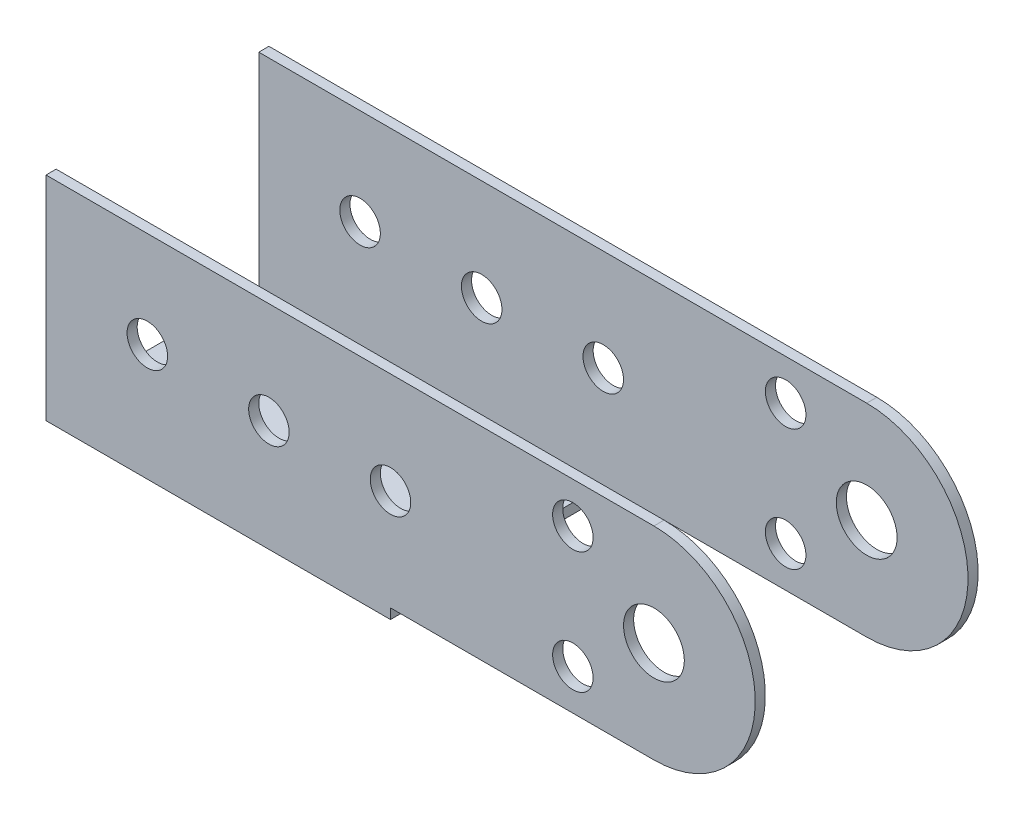
ISO-10303-21;
HEADER;
FILE_DESCRIPTION(('STEP AP214'),'2;1');
FILE_NAME('part.step','',(''),(''),'','','');
FILE_SCHEMA(('AUTOMOTIVE_DESIGN { 1 0 10303 214 1 1 1 1 }'));
ENDSEC;
DATA;
#1=APPLICATION_CONTEXT('core data for automotive mechanical design processes');
#2=APPLICATION_PROTOCOL_DEFINITION('international standard','automotive_design',2000,#1);
#3=PRODUCT_CONTEXT('',#1,'mechanical');
#4=PRODUCT('Part','Part','',(#3));
#5=PRODUCT_RELATED_PRODUCT_CATEGORY('part','',(#4));
#6=PRODUCT_DEFINITION_FORMATION('','',#4);
#7=PRODUCT_DEFINITION_CONTEXT('part definition',#1,'design');
#8=PRODUCT_DEFINITION('design','',#6,#7);
#9=PRODUCT_DEFINITION_SHAPE('','',#8);
#10=(LENGTH_UNIT() NAMED_UNIT(*) SI_UNIT(.MILLI.,.METRE.));
#11=(NAMED_UNIT(*) PLANE_ANGLE_UNIT() SI_UNIT($,.RADIAN.));
#12=(NAMED_UNIT(*) SI_UNIT($,.STERADIAN.) SOLID_ANGLE_UNIT());
#13=UNCERTAINTY_MEASURE_WITH_UNIT(LENGTH_MEASURE(1.E-05),#10,'distance_accuracy_value','');
#14=(GEOMETRIC_REPRESENTATION_CONTEXT(3) GLOBAL_UNCERTAINTY_ASSIGNED_CONTEXT((#13)) GLOBAL_UNIT_ASSIGNED_CONTEXT((#10,
#11,#12)) REPRESENTATION_CONTEXT('',''));
#15=CARTESIAN_POINT('',(0.,0.,0.));
#16=DIRECTION('',(0.,0.,1.));
#17=DIRECTION('',(1.,0.,0.));
#18=AXIS2_PLACEMENT_3D('',#15,#16,#17);
#19=CARTESIAN_POINT('',(15.,0.,10.5));
#20=DIRECTION('',(0.,0.,1.));
#21=DIRECTION('',(1.,0.,0.));
#22=AXIS2_PLACEMENT_3D('',#19,#20,#21);
#23=PLANE('',#22);
#24=CARTESIAN_POINT('',(-3.99999999999999,0.,10.5));
#25=DIRECTION('',(0.,0.,1.));
#26=DIRECTION('',(1.,0.,0.));
#27=AXIS2_PLACEMENT_3D('',#24,#25,#26);
#28=CIRCLE('',#27,1.);
#29=CARTESIAN_POINT('',(-2.99999999999999,0.,10.5));
#30=VERTEX_POINT('',#29);
#31=EDGE_CURVE('E193',#30,#30,#28,.T.);
#32=ORIENTED_EDGE('',*,*,#31,.F.);
#33=EDGE_LOOP('',(#32));
#34=FACE_BOUND('',#33,.T.);
#35=CARTESIAN_POINT('',(11.,3.,10.5));
#36=DIRECTION('',(0.,0.,1.));
#37=DIRECTION('',(1.,0.,0.));
#38=AXIS2_PLACEMENT_3D('',#35,#36,#37);
#39=CIRCLE('',#38,1.);
#40=CARTESIAN_POINT('',(12.,3.,10.5));
#41=VERTEX_POINT('',#40);
#42=EDGE_CURVE('E205',#41,#41,#39,.T.);
#43=ORIENTED_EDGE('',*,*,#42,.F.);
#44=EDGE_LOOP('',(#43));
#45=FACE_BOUND('',#44,.T.);
#46=CARTESIAN_POINT('',(15.,0.,10.5));
#47=DIRECTION('',(0.,0.,1.));
#48=DIRECTION('',(1.,0.,0.));
#49=AXIS2_PLACEMENT_3D('',#46,#47,#48);
#50=CIRCLE('',#49,1.5);
#51=CARTESIAN_POINT('',(16.5,0.,10.5));
#52=VERTEX_POINT('',#51);
#53=EDGE_CURVE('E217',#52,#52,#50,.T.);
#54=ORIENTED_EDGE('',*,*,#53,.F.);
#55=EDGE_LOOP('',(#54));
#56=FACE_BOUND('',#55,.T.);
#57=DIRECTION('',(0.,-1.,0.));
#58=VECTOR('',#57,1.);
#59=CARTESIAN_POINT('',(-15.,5.,10.5));
#60=LINE('',#59,#58);
#61=CARTESIAN_POINT('',(-15.,5.,10.5));
#62=VERTEX_POINT('',#61);
#63=CARTESIAN_POINT('',(-15.,-5.5,10.5));
#64=VERTEX_POINT('',#63);
#65=EDGE_CURVE('E223',#62,#64,#60,.T.);
#66=ORIENTED_EDGE('',*,*,#65,.T.);
#67=DIRECTION('',(1.,0.,0.));
#68=VECTOR('',#67,1.);
#69=CARTESIAN_POINT('',(2.00000000000001,-5.5,10.5));
#70=LINE('',#69,#68);
#71=CARTESIAN_POINT('',(2.00000000000001,-5.5,10.5));
#72=VERTEX_POINT('',#71);
#73=EDGE_CURVE('E167',#64,#72,#70,.T.);
#74=ORIENTED_EDGE('',*,*,#73,.T.);
#75=DIRECTION('',(0.,1.,0.));
#76=VECTOR('',#75,1.);
#77=CARTESIAN_POINT('',(2.00000000000001,-5.5,10.5));
#78=LINE('',#77,#76);
#79=CARTESIAN_POINT('',(2.00000000000001,-5.,10.5));
#80=VERTEX_POINT('',#79);
#81=EDGE_CURVE('E176',#72,#80,#78,.T.);
#82=ORIENTED_EDGE('',*,*,#81,.T.);
#83=DIRECTION('',(1.,0.,0.));
#84=VECTOR('',#83,1.);
#85=CARTESIAN_POINT('',(-15.,-5.,10.5));
#86=LINE('',#85,#84);
#87=CARTESIAN_POINT('',(15.,-5.,10.5));
#88=VERTEX_POINT('',#87);
#89=EDGE_CURVE('E225',#80,#88,#86,.T.);
#90=ORIENTED_EDGE('',*,*,#89,.T.);
#91=CARTESIAN_POINT('',(15.,0.,10.5));
#92=DIRECTION('',(0.,0.,1.));
#93=DIRECTION('',(1.,0.,0.));
#94=AXIS2_PLACEMENT_3D('',#91,#92,#93);
#95=CIRCLE('',#94,5.);
#96=CARTESIAN_POINT('',(15.,5.,10.5));
#97=VERTEX_POINT('',#96);
#98=EDGE_CURVE('E228',#88,#97,#95,.T.);
#99=ORIENTED_EDGE('',*,*,#98,.T.);
#100=DIRECTION('',(-1.,0.,0.));
#101=VECTOR('',#100,1.);
#102=CARTESIAN_POINT('',(15.,5.,10.5));
#103=LINE('',#102,#101);
#104=EDGE_CURVE('E230',#97,#62,#103,.T.);
#105=ORIENTED_EDGE('',*,*,#104,.T.);
#106=EDGE_LOOP('',(#66,#74,#82,#90,#99,#105));
#107=FACE_BOUND('',#106,.T.);
#108=CARTESIAN_POINT('',(11.,-3.,10.5));
#109=DIRECTION('',(0.,0.,1.));
#110=DIRECTION('',(1.,0.,0.));
#111=AXIS2_PLACEMENT_3D('',#108,#109,#110);
#112=CIRCLE('',#111,1.);
#113=CARTESIAN_POINT('',(12.,-3.,10.5));
#114=VERTEX_POINT('',#113);
#115=EDGE_CURVE('E211',#114,#114,#112,.T.);
#116=ORIENTED_EDGE('',*,*,#115,.F.);
#117=EDGE_LOOP('',(#116));
#118=FACE_BOUND('',#117,.T.);
#119=CARTESIAN_POINT('',(2.00000000000001,0.,10.5));
#120=DIRECTION('',(0.,0.,1.));
#121=DIRECTION('',(1.,0.,0.));
#122=AXIS2_PLACEMENT_3D('',#119,#120,#121);
#123=CIRCLE('',#122,1.);
#124=CARTESIAN_POINT('',(3.00000000000001,0.,10.5));
#125=VERTEX_POINT('',#124);
#126=EDGE_CURVE('E199',#125,#125,#123,.T.);
#127=ORIENTED_EDGE('',*,*,#126,.F.);
#128=EDGE_LOOP('',(#127));
#129=FACE_BOUND('',#128,.T.);
#130=CARTESIAN_POINT('',(-10.,0.253438211378566,10.5));
#131=DIRECTION('',(0.,0.,1.));
#132=DIRECTION('',(1.,0.,0.));
#133=AXIS2_PLACEMENT_3D('',#130,#131,#132);
#134=CIRCLE('',#133,1.);
#135=CARTESIAN_POINT('',(-9.,0.253438211378566,10.5));
#136=VERTEX_POINT('',#135);
#137=EDGE_CURVE('E187',#136,#136,#134,.T.);
#138=ORIENTED_EDGE('',*,*,#137,.F.);
#139=EDGE_LOOP('',(#138));
#140=FACE_BOUND('',#139,.T.);
#141=ADVANCED_FACE('F35',(#34,#45,#56,#107,#118,#129,#140),#23,.T.);
#142=CARTESIAN_POINT('',(15.,0.,10.));
#143=DIRECTION('',(0.,0.,1.));
#144=DIRECTION('',(1.,0.,0.));
#145=AXIS2_PLACEMENT_3D('',#142,#143,#144);
#146=PLANE('',#145);
#147=DIRECTION('',(0.,-1.,0.));
#148=VECTOR('',#147,1.);
#149=CARTESIAN_POINT('',(-15.,5.,10.));
#150=LINE('',#149,#148);
#151=CARTESIAN_POINT('',(-15.,5.,10.));
#152=VERTEX_POINT('',#151);
#153=CARTESIAN_POINT('',(-15.,-5.,10.));
#154=VERTEX_POINT('',#153);
#155=EDGE_CURVE('E220',#152,#154,#150,.T.);
#156=ORIENTED_EDGE('',*,*,#155,.F.);
#157=DIRECTION('',(-1.,0.,0.));
#158=VECTOR('',#157,1.);
#159=CARTESIAN_POINT('',(15.,5.,10.));
#160=LINE('',#159,#158);
#161=CARTESIAN_POINT('',(15.,5.,10.));
#162=VERTEX_POINT('',#161);
#163=EDGE_CURVE('E226',#162,#152,#160,.T.);
#164=ORIENTED_EDGE('',*,*,#163,.F.);
#165=CARTESIAN_POINT('',(15.,0.,10.));
#166=DIRECTION('',(0.,0.,1.));
#167=DIRECTION('',(1.,0.,0.));
#168=AXIS2_PLACEMENT_3D('',#165,#166,#167);
#169=CIRCLE('',#168,5.);
#170=CARTESIAN_POINT('',(15.,-5.,10.));
#171=VERTEX_POINT('',#170);
#172=EDGE_CURVE('E238',#171,#162,#169,.T.);
#173=ORIENTED_EDGE('',*,*,#172,.F.);
#174=DIRECTION('',(1.,0.,0.));
#175=VECTOR('',#174,1.);
#176=CARTESIAN_POINT('',(-15.,-5.,10.));
#177=LINE('',#176,#175);
#178=CARTESIAN_POINT('',(2.00000000000001,-5.,10.));
#179=VERTEX_POINT('',#178);
#180=EDGE_CURVE('E235',#179,#171,#177,.T.);
#181=ORIENTED_EDGE('',*,*,#180,.F.);
#182=EDGE_CURVE('E236',#154,#179,#177,.T.);
#183=ORIENTED_EDGE('',*,*,#182,.F.);
#184=EDGE_LOOP('',(#156,#164,#173,#181,#183));
#185=FACE_BOUND('',#184,.T.);
#186=CARTESIAN_POINT('',(15.,0.,10.));
#187=DIRECTION('',(0.,0.,1.));
#188=DIRECTION('',(1.,0.,0.));
#189=AXIS2_PLACEMENT_3D('',#186,#187,#188);
#190=CIRCLE('',#189,1.5);
#191=CARTESIAN_POINT('',(16.5,0.,10.));
#192=VERTEX_POINT('',#191);
#193=EDGE_CURVE('E214',#192,#192,#190,.T.);
#194=ORIENTED_EDGE('',*,*,#193,.T.);
#195=EDGE_LOOP('',(#194));
#196=FACE_BOUND('',#195,.T.);
#197=CARTESIAN_POINT('',(11.,-3.,10.));
#198=DIRECTION('',(0.,0.,1.));
#199=DIRECTION('',(1.,0.,0.));
#200=AXIS2_PLACEMENT_3D('',#197,#198,#199);
#201=CIRCLE('',#200,1.);
#202=CARTESIAN_POINT('',(12.,-3.,10.));
#203=VERTEX_POINT('',#202);
#204=EDGE_CURVE('E208',#203,#203,#201,.T.);
#205=ORIENTED_EDGE('',*,*,#204,.T.);
#206=EDGE_LOOP('',(#205));
#207=FACE_BOUND('',#206,.T.);
#208=CARTESIAN_POINT('',(11.,3.,10.));
#209=DIRECTION('',(0.,0.,1.));
#210=DIRECTION('',(1.,0.,0.));
#211=AXIS2_PLACEMENT_3D('',#208,#209,#210);
#212=CIRCLE('',#211,1.);
#213=CARTESIAN_POINT('',(12.,3.,10.));
#214=VERTEX_POINT('',#213);
#215=EDGE_CURVE('E202',#214,#214,#212,.T.);
#216=ORIENTED_EDGE('',*,*,#215,.T.);
#217=EDGE_LOOP('',(#216));
#218=FACE_BOUND('',#217,.T.);
#219=CARTESIAN_POINT('',(2.00000000000001,0.,10.));
#220=DIRECTION('',(0.,0.,1.));
#221=DIRECTION('',(1.,0.,0.));
#222=AXIS2_PLACEMENT_3D('',#219,#220,#221);
#223=CIRCLE('',#222,1.);
#224=CARTESIAN_POINT('',(3.00000000000001,0.,10.));
#225=VERTEX_POINT('',#224);
#226=EDGE_CURVE('E196',#225,#225,#223,.T.);
#227=ORIENTED_EDGE('',*,*,#226,.T.);
#228=EDGE_LOOP('',(#227));
#229=FACE_BOUND('',#228,.T.);
#230=CARTESIAN_POINT('',(-3.99999999999999,0.,10.));
#231=DIRECTION('',(0.,0.,1.));
#232=DIRECTION('',(1.,0.,0.));
#233=AXIS2_PLACEMENT_3D('',#230,#231,#232);
#234=CIRCLE('',#233,1.);
#235=CARTESIAN_POINT('',(-2.99999999999999,0.,10.));
#236=VERTEX_POINT('',#235);
#237=EDGE_CURVE('E190',#236,#236,#234,.T.);
#238=ORIENTED_EDGE('',*,*,#237,.T.);
#239=EDGE_LOOP('',(#238));
#240=FACE_BOUND('',#239,.T.);
#241=CARTESIAN_POINT('',(-10.,0.253438211378566,10.));
#242=DIRECTION('',(0.,0.,1.));
#243=DIRECTION('',(1.,0.,0.));
#244=AXIS2_PLACEMENT_3D('',#241,#242,#243);
#245=CIRCLE('',#244,1.);
#246=CARTESIAN_POINT('',(-9.,0.253438211378566,10.));
#247=VERTEX_POINT('',#246);
#248=EDGE_CURVE('E182',#247,#247,#245,.T.);
#249=ORIENTED_EDGE('',*,*,#248,.T.);
#250=EDGE_LOOP('',(#249));
#251=FACE_BOUND('',#250,.T.);
#252=ADVANCED_FACE('F254',(#185,#196,#207,#218,#229,#240,#251),#146,.F.);
#253=CARTESIAN_POINT('',(-15.,5.,10.5));
#254=DIRECTION('',(1.,0.,0.));
#255=DIRECTION('',(0.,0.,-1.));
#256=AXIS2_PLACEMENT_3D('',#253,#254,#255);
#257=PLANE('',#256);
#258=ORIENTED_EDGE('',*,*,#155,.T.);
#259=DIRECTION('',(0.,0.,1.));
#260=VECTOR('',#259,1.);
#261=CARTESIAN_POINT('',(-15.,-5.,10.5));
#262=LINE('',#261,#260);
#263=CARTESIAN_POINT('',(-15.,-5.,0.));
#264=VERTEX_POINT('',#263);
#265=EDGE_CURVE('E162',#264,#154,#262,.T.);
#266=ORIENTED_EDGE('',*,*,#265,.F.);
#267=DIRECTION('',(0.,-1.,0.));
#268=VECTOR('',#267,1.);
#269=CARTESIAN_POINT('',(-15.,5.,0.));
#270=LINE('',#269,#268);
#271=CARTESIAN_POINT('',(-15.,5.,0.));
#272=VERTEX_POINT('',#271);
#273=EDGE_CURVE('E158',#272,#264,#270,.T.);
#274=ORIENTED_EDGE('',*,*,#273,.F.);
#275=DIRECTION('',(0.,0.,1.));
#276=VECTOR('',#275,1.);
#277=CARTESIAN_POINT('',(-15.,5.,-0.5));
#278=LINE('',#277,#276);
#279=CARTESIAN_POINT('',(-15.,5.,-0.5));
#280=VERTEX_POINT('',#279);
#281=EDGE_CURVE('E129',#280,#272,#278,.T.);
#282=ORIENTED_EDGE('',*,*,#281,.F.);
#283=DIRECTION('',(0.,1.,0.));
#284=VECTOR('',#283,1.);
#285=CARTESIAN_POINT('',(-15.,-5.5,-0.5));
#286=LINE('',#285,#284);
#287=CARTESIAN_POINT('',(-15.,-5.5,-0.5));
#288=VERTEX_POINT('',#287);
#289=EDGE_CURVE('E139',#288,#280,#286,.T.);
#290=ORIENTED_EDGE('',*,*,#289,.F.);
#291=DIRECTION('',(0.,0.,1.));
#292=VECTOR('',#291,1.);
#293=CARTESIAN_POINT('',(-15.,-5.5,10.5));
#294=LINE('',#293,#292);
#295=EDGE_CURVE('E164',#288,#64,#294,.T.);
#296=ORIENTED_EDGE('',*,*,#295,.T.);
#297=ORIENTED_EDGE('',*,*,#65,.F.);
#298=DIRECTION('',(0.,0.,-1.));
#299=VECTOR('',#298,1.);
#300=CARTESIAN_POINT('',(-15.,5.,10.5));
#301=LINE('',#300,#299);
#302=EDGE_CURVE('E232',#62,#152,#301,.T.);
#303=ORIENTED_EDGE('',*,*,#302,.T.);
#304=EDGE_LOOP('',(#258,#266,#274,#282,#290,#296,#297,#303));
#305=FACE_BOUND('',#304,.T.);
#306=ADVANCED_FACE('F37',(#305),#257,.F.);
#307=CARTESIAN_POINT('',(-15.,-5.,10.5));
#308=DIRECTION('',(0.,1.,0.));
#309=DIRECTION('',(0.,0.,1.));
#310=AXIS2_PLACEMENT_3D('',#307,#308,#309);
#311=PLANE('',#310);
#312=ORIENTED_EDGE('',*,*,#89,.F.);
#313=DIRECTION('',(0.,0.,-1.));
#314=VECTOR('',#313,1.);
#315=CARTESIAN_POINT('',(2.00000000000001,-5.,-0.5));
#316=LINE('',#315,#314);
#317=EDGE_CURVE('E168',#80,#179,#316,.T.);
#318=ORIENTED_EDGE('',*,*,#317,.T.);
#319=ORIENTED_EDGE('',*,*,#180,.T.);
#320=DIRECTION('',(0.,0.,-1.));
#321=VECTOR('',#320,1.);
#322=CARTESIAN_POINT('',(15.,-5.,10.5));
#323=LINE('',#322,#321);
#324=EDGE_CURVE('E11',#88,#171,#323,.T.);
#325=ORIENTED_EDGE('',*,*,#324,.F.);
#326=EDGE_LOOP('',(#312,#318,#319,#325));
#327=FACE_BOUND('',#326,.T.);
#328=ADVANCED_FACE('F273',(#327),#311,.F.);
#329=CARTESIAN_POINT('',(15.,0.,10.5));
#330=DIRECTION('',(0.,0.,-1.));
#331=DIRECTION('',(-1.,0.,0.));
#332=AXIS2_PLACEMENT_3D('',#329,#330,#331);
#333=CYLINDRICAL_SURFACE('',#332,5.);
#334=ORIENTED_EDGE('',*,*,#172,.T.);
#335=DIRECTION('',(0.,0.,-1.));
#336=VECTOR('',#335,1.);
#337=CARTESIAN_POINT('',(15.,5.,10.5));
#338=LINE('',#337,#336);
#339=EDGE_CURVE('E43',#97,#162,#338,.T.);
#340=ORIENTED_EDGE('',*,*,#339,.F.);
#341=ORIENTED_EDGE('',*,*,#98,.F.);
#342=ORIENTED_EDGE('',*,*,#324,.T.);
#343=EDGE_LOOP('',(#334,#340,#341,#342));
#344=FACE_BOUND('',#343,.T.);
#345=ADVANCED_FACE('F274',(#344),#333,.T.);
#346=CARTESIAN_POINT('',(15.,5.,10.5));
#347=DIRECTION('',(0.,-1.,0.));
#348=DIRECTION('',(0.,0.,-1.));
#349=AXIS2_PLACEMENT_3D('',#346,#347,#348);
#350=PLANE('',#349);
#351=ORIENTED_EDGE('',*,*,#163,.T.);
#352=ORIENTED_EDGE('',*,*,#302,.F.);
#353=ORIENTED_EDGE('',*,*,#104,.F.);
#354=ORIENTED_EDGE('',*,*,#339,.T.);
#355=EDGE_LOOP('',(#351,#352,#353,#354));
#356=FACE_BOUND('',#355,.T.);
#357=ADVANCED_FACE('F247',(#356),#350,.F.);
#358=CARTESIAN_POINT('',(15.,0.,10.5));
#359=DIRECTION('',(0.,0.,-1.));
#360=DIRECTION('',(-1.,0.,0.));
#361=AXIS2_PLACEMENT_3D('',#358,#359,#360);
#362=CYLINDRICAL_SURFACE('',#361,1.5);
#363=ORIENTED_EDGE('',*,*,#53,.T.);
#364=EDGE_LOOP('',(#363));
#365=FACE_BOUND('',#364,.T.);
#366=ORIENTED_EDGE('',*,*,#193,.F.);
#367=EDGE_LOOP('',(#366));
#368=FACE_BOUND('',#367,.T.);
#369=ADVANCED_FACE('F281',(#365,#368),#362,.F.);
#370=CARTESIAN_POINT('',(11.,-3.,10.5));
#371=DIRECTION('',(0.,0.,-1.));
#372=DIRECTION('',(-1.,0.,0.));
#373=AXIS2_PLACEMENT_3D('',#370,#371,#372);
#374=CYLINDRICAL_SURFACE('',#373,1.);
#375=ORIENTED_EDGE('',*,*,#115,.T.);
#376=EDGE_LOOP('',(#375));
#377=FACE_BOUND('',#376,.T.);
#378=ORIENTED_EDGE('',*,*,#204,.F.);
#379=EDGE_LOOP('',(#378));
#380=FACE_BOUND('',#379,.T.);
#381=ADVANCED_FACE('F295',(#377,#380),#374,.F.);
#382=CARTESIAN_POINT('',(11.,3.,10.5));
#383=DIRECTION('',(0.,0.,-1.));
#384=DIRECTION('',(-1.,0.,0.));
#385=AXIS2_PLACEMENT_3D('',#382,#383,#384);
#386=CYLINDRICAL_SURFACE('',#385,1.);
#387=ORIENTED_EDGE('',*,*,#42,.T.);
#388=EDGE_LOOP('',(#387));
#389=FACE_BOUND('',#388,.T.);
#390=ORIENTED_EDGE('',*,*,#215,.F.);
#391=EDGE_LOOP('',(#390));
#392=FACE_BOUND('',#391,.T.);
#393=ADVANCED_FACE('F299',(#389,#392),#386,.F.);
#394=CARTESIAN_POINT('',(2.00000000000001,0.,10.5));
#395=DIRECTION('',(0.,0.,-1.));
#396=DIRECTION('',(-1.,0.,0.));
#397=AXIS2_PLACEMENT_3D('',#394,#395,#396);
#398=CYLINDRICAL_SURFACE('',#397,1.);
#399=ORIENTED_EDGE('',*,*,#126,.T.);
#400=EDGE_LOOP('',(#399));
#401=FACE_BOUND('',#400,.T.);
#402=ORIENTED_EDGE('',*,*,#226,.F.);
#403=EDGE_LOOP('',(#402));
#404=FACE_BOUND('',#403,.T.);
#405=ADVANCED_FACE('F303',(#401,#404),#398,.F.);
#406=CARTESIAN_POINT('',(-3.99999999999999,0.,10.5));
#407=DIRECTION('',(0.,0.,-1.));
#408=DIRECTION('',(-1.,0.,0.));
#409=AXIS2_PLACEMENT_3D('',#406,#407,#408);
#410=CYLINDRICAL_SURFACE('',#409,1.);
#411=ORIENTED_EDGE('',*,*,#31,.T.);
#412=EDGE_LOOP('',(#411));
#413=FACE_BOUND('',#412,.T.);
#414=ORIENTED_EDGE('',*,*,#237,.F.);
#415=EDGE_LOOP('',(#414));
#416=FACE_BOUND('',#415,.T.);
#417=ADVANCED_FACE('F307',(#413,#416),#410,.F.);
#418=CARTESIAN_POINT('',(-10.,0.253438211378566,10.5));
#419=DIRECTION('',(0.,0.,-1.));
#420=DIRECTION('',(-1.,0.,0.));
#421=AXIS2_PLACEMENT_3D('',#418,#419,#420);
#422=CYLINDRICAL_SURFACE('',#421,1.);
#423=ORIENTED_EDGE('',*,*,#137,.T.);
#424=EDGE_LOOP('',(#423));
#425=FACE_BOUND('',#424,.T.);
#426=ORIENTED_EDGE('',*,*,#248,.F.);
#427=EDGE_LOOP('',(#426));
#428=FACE_BOUND('',#427,.T.);
#429=ADVANCED_FACE('F311',(#425,#428),#422,.F.);
#430=CARTESIAN_POINT('',(0.,-5.,0.));
#431=DIRECTION('',(0.,-1.,0.));
#432=DIRECTION('',(0.,0.,-1.));
#433=AXIS2_PLACEMENT_3D('',#430,#431,#432);
#434=PLANE('',#433);
#435=CARTESIAN_POINT('',(2.00000000000001,-5.,0.));
#436=VERTEX_POINT('',#435);
#437=EDGE_CURVE('E180',#179,#436,#316,.T.);
#438=ORIENTED_EDGE('',*,*,#437,.T.);
#439=DIRECTION('',(1.,0.,0.));
#440=VECTOR('',#439,1.);
#441=CARTESIAN_POINT('',(-15.,-5.,0.));
#442=LINE('',#441,#440);
#443=EDGE_CURVE('E50',#264,#436,#442,.T.);
#444=ORIENTED_EDGE('',*,*,#443,.F.);
#445=ORIENTED_EDGE('',*,*,#265,.T.);
#446=ORIENTED_EDGE('',*,*,#182,.T.);
#447=EDGE_LOOP('',(#438,#444,#445,#446));
#448=FACE_BOUND('',#447,.T.);
#449=ADVANCED_FACE('F315',(#448),#434,.F.);
#450=CARTESIAN_POINT('',(-15.,-5.5,-0.5));
#451=DIRECTION('',(0.,0.,-1.));
#452=DIRECTION('',(-1.,0.,0.));
#453=AXIS2_PLACEMENT_3D('',#450,#451,#452);
#454=PLANE('',#453);
#455=ORIENTED_EDGE('',*,*,#289,.T.);
#456=DIRECTION('',(-1.,0.,0.));
#457=VECTOR('',#456,1.);
#458=CARTESIAN_POINT('',(-15.,5.,-0.5));
#459=LINE('',#458,#457);
#460=CARTESIAN_POINT('',(15.,5.,-0.5));
#461=VERTEX_POINT('',#460);
#462=EDGE_CURVE('E122',#461,#280,#459,.T.);
#463=ORIENTED_EDGE('',*,*,#462,.F.);
#464=CARTESIAN_POINT('',(15.,0.,-0.5));
#465=DIRECTION('',(0.,0.,1.));
#466=DIRECTION('',(1.,0.,0.));
#467=AXIS2_PLACEMENT_3D('',#464,#465,#466);
#468=CIRCLE('',#467,5.);
#469=CARTESIAN_POINT('',(15.,-5.,-0.5));
#470=VERTEX_POINT('',#469);
#471=EDGE_CURVE('E137',#470,#461,#468,.T.);
#472=ORIENTED_EDGE('',*,*,#471,.F.);
#473=DIRECTION('',(1.,0.,0.));
#474=VECTOR('',#473,1.);
#475=CARTESIAN_POINT('',(-15.,-5.,-0.5));
#476=LINE('',#475,#474);
#477=CARTESIAN_POINT('',(2.00000000000001,-5.,-0.5));
#478=VERTEX_POINT('',#477);
#479=EDGE_CURVE('E130',#478,#470,#476,.T.);
#480=ORIENTED_EDGE('',*,*,#479,.F.);
#481=DIRECTION('',(0.,1.,0.));
#482=VECTOR('',#481,1.);
#483=CARTESIAN_POINT('',(2.00000000000001,-5.5,-0.5));
#484=LINE('',#483,#482);
#485=CARTESIAN_POINT('',(2.00000000000001,-5.5,-0.5));
#486=VERTEX_POINT('',#485);
#487=EDGE_CURVE('E183',#486,#478,#484,.T.);
#488=ORIENTED_EDGE('',*,*,#487,.F.);
#489=DIRECTION('',(-1.,0.,0.));
#490=VECTOR('',#489,1.);
#491=CARTESIAN_POINT('',(-15.,-5.5,-0.5));
#492=LINE('',#491,#490);
#493=EDGE_CURVE('E174',#486,#288,#492,.T.);
#494=ORIENTED_EDGE('',*,*,#493,.T.);
#495=EDGE_LOOP('',(#455,#463,#472,#480,#488,#494));
#496=FACE_BOUND('',#495,.T.);
#497=CARTESIAN_POINT('',(11.,-3.,-0.5));
#498=DIRECTION('',(0.,0.,1.));
#499=DIRECTION('',(1.,0.,0.));
#500=AXIS2_PLACEMENT_3D('',#497,#498,#499);
#501=CIRCLE('',#500,1.);
#502=CARTESIAN_POINT('',(12.,-3.,-0.5));
#503=VERTEX_POINT('',#502);
#504=EDGE_CURVE('E365',#503,#503,#501,.T.);
#505=ORIENTED_EDGE('',*,*,#504,.T.);
#506=EDGE_LOOP('',(#505));
#507=FACE_BOUND('',#506,.T.);
#508=CARTESIAN_POINT('',(11.,3.,-0.5));
#509=DIRECTION('',(0.,0.,1.));
#510=DIRECTION('',(1.,0.,0.));
#511=AXIS2_PLACEMENT_3D('',#508,#509,#510);
#512=CIRCLE('',#511,1.);
#513=CARTESIAN_POINT('',(12.,3.,-0.5));
#514=VERTEX_POINT('',#513);
#515=EDGE_CURVE('E373',#514,#514,#512,.T.);
#516=ORIENTED_EDGE('',*,*,#515,.T.);
#517=EDGE_LOOP('',(#516));
#518=FACE_BOUND('',#517,.T.);
#519=CARTESIAN_POINT('',(2.00000000000001,0.,-0.5));
#520=DIRECTION('',(0.,0.,1.));
#521=DIRECTION('',(1.,0.,0.));
#522=AXIS2_PLACEMENT_3D('',#519,#520,#521);
#523=CIRCLE('',#522,1.);
#524=CARTESIAN_POINT('',(3.00000000000001,0.,-0.5));
#525=VERTEX_POINT('',#524);
#526=EDGE_CURVE('E379',#525,#525,#523,.T.);
#527=ORIENTED_EDGE('',*,*,#526,.T.);
#528=EDGE_LOOP('',(#527));
#529=FACE_BOUND('',#528,.T.);
#530=CARTESIAN_POINT('',(-3.99999999999999,0.,-0.5));
#531=DIRECTION('',(0.,0.,1.));
#532=DIRECTION('',(1.,0.,0.));
#533=AXIS2_PLACEMENT_3D('',#530,#531,#532);
#534=CIRCLE('',#533,1.);
#535=CARTESIAN_POINT('',(-2.99999999999999,0.,-0.5));
#536=VERTEX_POINT('',#535);
#537=EDGE_CURVE('E385',#536,#536,#534,.T.);
#538=ORIENTED_EDGE('',*,*,#537,.T.);
#539=EDGE_LOOP('',(#538));
#540=FACE_BOUND('',#539,.T.);
#541=CARTESIAN_POINT('',(-10.,0.253438211378566,-0.5));
#542=DIRECTION('',(0.,0.,1.));
#543=DIRECTION('',(1.,0.,0.));
#544=AXIS2_PLACEMENT_3D('',#541,#542,#543);
#545=CIRCLE('',#544,1.);
#546=CARTESIAN_POINT('',(-9.,0.253438211378566,-0.5));
#547=VERTEX_POINT('',#546);
#548=EDGE_CURVE('E391',#547,#547,#545,.T.);
#549=ORIENTED_EDGE('',*,*,#548,.T.);
#550=EDGE_LOOP('',(#549));
#551=FACE_BOUND('',#550,.T.);
#552=CARTESIAN_POINT('',(15.,0.,-0.5));
#553=DIRECTION('',(0.,0.,1.));
#554=DIRECTION('',(1.,0.,0.));
#555=AXIS2_PLACEMENT_3D('',#552,#553,#554);
#556=CIRCLE('',#555,1.5);
#557=CARTESIAN_POINT('',(16.5,0.,-0.5));
#558=VERTEX_POINT('',#557);
#559=EDGE_CURVE('E156',#558,#558,#556,.T.);
#560=ORIENTED_EDGE('',*,*,#559,.T.);
#561=EDGE_LOOP('',(#560));
#562=FACE_BOUND('',#561,.T.);
#563=ADVANCED_FACE('F134',(#496,#507,#518,#529,#540,#551,#562),#454,.T.);
#564=CARTESIAN_POINT('',(2.00000000000001,-5.5,-0.5));
#565=DIRECTION('',(1.,0.,0.));
#566=DIRECTION('',(0.,0.,-1.));
#567=AXIS2_PLACEMENT_3D('',#564,#565,#566);
#568=PLANE('',#567);
#569=ORIENTED_EDGE('',*,*,#317,.F.);
#570=ORIENTED_EDGE('',*,*,#81,.F.);
#571=DIRECTION('',(0.,0.,-1.));
#572=VECTOR('',#571,1.);
#573=CARTESIAN_POINT('',(2.00000000000001,-5.5,-0.5));
#574=LINE('',#573,#572);
#575=EDGE_CURVE('E171',#72,#486,#574,.T.);
#576=ORIENTED_EDGE('',*,*,#575,.T.);
#577=ORIENTED_EDGE('',*,*,#487,.T.);
#578=EDGE_CURVE('E58',#436,#478,#316,.T.);
#579=ORIENTED_EDGE('',*,*,#578,.F.);
#580=ORIENTED_EDGE('',*,*,#437,.F.);
#581=EDGE_LOOP('',(#569,#570,#576,#577,#579,#580));
#582=FACE_BOUND('',#581,.T.);
#583=ADVANCED_FACE('F269',(#582),#568,.T.);
#584=CARTESIAN_POINT('',(0.,-5.5,0.));
#585=DIRECTION('',(0.,-1.,0.));
#586=DIRECTION('',(0.,0.,-1.));
#587=AXIS2_PLACEMENT_3D('',#584,#585,#586);
#588=PLANE('',#587);
#589=ORIENTED_EDGE('',*,*,#295,.F.);
#590=ORIENTED_EDGE('',*,*,#493,.F.);
#591=ORIENTED_EDGE('',*,*,#575,.F.);
#592=ORIENTED_EDGE('',*,*,#73,.F.);
#593=EDGE_LOOP('',(#589,#590,#591,#592));
#594=FACE_BOUND('',#593,.T.);
#595=ADVANCED_FACE('F267',(#594),#588,.T.);
#596=CARTESIAN_POINT('',(15.,0.,-0.5));
#597=DIRECTION('',(0.,0.,1.));
#598=DIRECTION('',(1.,0.,0.));
#599=AXIS2_PLACEMENT_3D('',#596,#597,#598);
#600=CYLINDRICAL_SURFACE('',#599,5.);
#601=CARTESIAN_POINT('',(15.,0.,0.));
#602=DIRECTION('',(0.,0.,1.));
#603=DIRECTION('',(1.,0.,0.));
#604=AXIS2_PLACEMENT_3D('',#601,#602,#603);
#605=CIRCLE('',#604,5.);
#606=CARTESIAN_POINT('',(15.,-5.,0.));
#607=VERTEX_POINT('',#606);
#608=CARTESIAN_POINT('',(15.,5.,0.));
#609=VERTEX_POINT('',#608);
#610=EDGE_CURVE('E154',#607,#609,#605,.T.);
#611=ORIENTED_EDGE('',*,*,#610,.F.);
#612=DIRECTION('',(0.,0.,1.));
#613=VECTOR('',#612,1.);
#614=CARTESIAN_POINT('',(15.,-5.,-0.5));
#615=LINE('',#614,#613);
#616=EDGE_CURVE('E145',#470,#607,#615,.T.);
#617=ORIENTED_EDGE('',*,*,#616,.F.);
#618=ORIENTED_EDGE('',*,*,#471,.T.);
#619=DIRECTION('',(0.,0.,1.));
#620=VECTOR('',#619,1.);
#621=CARTESIAN_POINT('',(15.,5.,-0.5));
#622=LINE('',#621,#620);
#623=EDGE_CURVE('E119',#461,#609,#622,.T.);
#624=ORIENTED_EDGE('',*,*,#623,.T.);
#625=EDGE_LOOP('',(#611,#617,#618,#624));
#626=FACE_BOUND('',#625,.T.);
#627=ADVANCED_FACE('F143',(#626),#600,.T.);
#628=CARTESIAN_POINT('',(-15.,-5.,-0.5));
#629=DIRECTION('',(0.,-1.,0.));
#630=DIRECTION('',(0.,0.,-1.));
#631=AXIS2_PLACEMENT_3D('',#628,#629,#630);
#632=PLANE('',#631);
#633=EDGE_CURVE('E147',#436,#607,#442,.T.);
#634=ORIENTED_EDGE('',*,*,#633,.F.);
#635=ORIENTED_EDGE('',*,*,#578,.T.);
#636=ORIENTED_EDGE('',*,*,#479,.T.);
#637=ORIENTED_EDGE('',*,*,#616,.T.);
#638=EDGE_LOOP('',(#634,#635,#636,#637));
#639=FACE_BOUND('',#638,.T.);
#640=ADVANCED_FACE('F327',(#639),#632,.T.);
#641=CARTESIAN_POINT('',(-15.,5.,-0.5));
#642=DIRECTION('',(0.,1.,0.));
#643=DIRECTION('',(0.,0.,1.));
#644=AXIS2_PLACEMENT_3D('',#641,#642,#643);
#645=PLANE('',#644);
#646=DIRECTION('',(-1.,0.,0.));
#647=VECTOR('',#646,1.);
#648=CARTESIAN_POINT('',(-15.,5.,0.));
#649=LINE('',#648,#647);
#650=EDGE_CURVE('E124',#609,#272,#649,.T.);
#651=ORIENTED_EDGE('',*,*,#650,.F.);
#652=ORIENTED_EDGE('',*,*,#623,.F.);
#653=ORIENTED_EDGE('',*,*,#462,.T.);
#654=ORIENTED_EDGE('',*,*,#281,.T.);
#655=EDGE_LOOP('',(#651,#652,#653,#654));
#656=FACE_BOUND('',#655,.T.);
#657=ADVANCED_FACE('F121',(#656),#645,.T.);
#658=CARTESIAN_POINT('',(15.,0.,0.));
#659=DIRECTION('',(0.,0.,1.));
#660=DIRECTION('',(1.,0.,0.));
#661=AXIS2_PLACEMENT_3D('',#658,#659,#660);
#662=PLANE('',#661);
#663=CARTESIAN_POINT('',(11.,-3.,0.));
#664=DIRECTION('',(0.,0.,1.));
#665=DIRECTION('',(1.,0.,0.));
#666=AXIS2_PLACEMENT_3D('',#663,#664,#665);
#667=CIRCLE('',#666,1.);
#668=CARTESIAN_POINT('',(12.,-3.,0.));
#669=VERTEX_POINT('',#668);
#670=EDGE_CURVE('E368',#669,#669,#667,.T.);
#671=ORIENTED_EDGE('',*,*,#670,.F.);
#672=EDGE_LOOP('',(#671));
#673=FACE_BOUND('',#672,.T.);
#674=CARTESIAN_POINT('',(11.,3.,0.));
#675=DIRECTION('',(0.,0.,1.));
#676=DIRECTION('',(1.,0.,0.));
#677=AXIS2_PLACEMENT_3D('',#674,#675,#676);
#678=CIRCLE('',#677,1.);
#679=CARTESIAN_POINT('',(12.,3.,0.));
#680=VERTEX_POINT('',#679);
#681=EDGE_CURVE('E370',#680,#680,#678,.T.);
#682=ORIENTED_EDGE('',*,*,#681,.F.);
#683=EDGE_LOOP('',(#682));
#684=FACE_BOUND('',#683,.T.);
#685=CARTESIAN_POINT('',(2.00000000000001,0.,0.));
#686=DIRECTION('',(0.,0.,1.));
#687=DIRECTION('',(1.,0.,0.));
#688=AXIS2_PLACEMENT_3D('',#685,#686,#687);
#689=CIRCLE('',#688,1.);
#690=CARTESIAN_POINT('',(3.00000000000001,0.,0.));
#691=VERTEX_POINT('',#690);
#692=EDGE_CURVE('E376',#691,#691,#689,.T.);
#693=ORIENTED_EDGE('',*,*,#692,.F.);
#694=EDGE_LOOP('',(#693));
#695=FACE_BOUND('',#694,.T.);
#696=CARTESIAN_POINT('',(-3.99999999999999,0.,0.));
#697=DIRECTION('',(0.,0.,1.));
#698=DIRECTION('',(1.,0.,0.));
#699=AXIS2_PLACEMENT_3D('',#696,#697,#698);
#700=CIRCLE('',#699,1.);
#701=CARTESIAN_POINT('',(-2.99999999999999,0.,0.));
#702=VERTEX_POINT('',#701);
#703=EDGE_CURVE('E382',#702,#702,#700,.T.);
#704=ORIENTED_EDGE('',*,*,#703,.F.);
#705=EDGE_LOOP('',(#704));
#706=FACE_BOUND('',#705,.T.);
#707=CARTESIAN_POINT('',(-10.,0.253438211378566,0.));
#708=DIRECTION('',(0.,0.,1.));
#709=DIRECTION('',(1.,0.,0.));
#710=AXIS2_PLACEMENT_3D('',#707,#708,#709);
#711=CIRCLE('',#710,1.);
#712=CARTESIAN_POINT('',(-9.,0.253438211378566,0.));
#713=VERTEX_POINT('',#712);
#714=EDGE_CURVE('E388',#713,#713,#711,.T.);
#715=ORIENTED_EDGE('',*,*,#714,.F.);
#716=EDGE_LOOP('',(#715));
#717=FACE_BOUND('',#716,.T.);
#718=CARTESIAN_POINT('',(15.,0.,0.));
#719=DIRECTION('',(0.,0.,1.));
#720=DIRECTION('',(1.,0.,0.));
#721=AXIS2_PLACEMENT_3D('',#718,#719,#720);
#722=CIRCLE('',#721,1.5);
#723=CARTESIAN_POINT('',(16.5,0.,0.));
#724=VERTEX_POINT('',#723);
#725=EDGE_CURVE('E150',#724,#724,#722,.T.);
#726=ORIENTED_EDGE('',*,*,#725,.F.);
#727=EDGE_LOOP('',(#726));
#728=FACE_BOUND('',#727,.T.);
#729=ORIENTED_EDGE('',*,*,#610,.T.);
#730=ORIENTED_EDGE('',*,*,#650,.T.);
#731=ORIENTED_EDGE('',*,*,#273,.T.);
#732=ORIENTED_EDGE('',*,*,#443,.T.);
#733=ORIENTED_EDGE('',*,*,#633,.T.);
#734=EDGE_LOOP('',(#729,#730,#731,#732,#733));
#735=FACE_BOUND('',#734,.T.);
#736=ADVANCED_FACE('F330',(#673,#684,#695,#706,#717,#728,#735),#662,.T.);
#737=CARTESIAN_POINT('',(15.,0.,-0.5));
#738=DIRECTION('',(0.,0.,1.));
#739=DIRECTION('',(1.,0.,0.));
#740=AXIS2_PLACEMENT_3D('',#737,#738,#739);
#741=CYLINDRICAL_SURFACE('',#740,1.5);
#742=ORIENTED_EDGE('',*,*,#559,.F.);
#743=EDGE_LOOP('',(#742));
#744=FACE_BOUND('',#743,.T.);
#745=ORIENTED_EDGE('',*,*,#725,.T.);
#746=EDGE_LOOP('',(#745));
#747=FACE_BOUND('',#746,.T.);
#748=ADVANCED_FACE('F336',(#744,#747),#741,.F.);
#749=CARTESIAN_POINT('',(-10.,0.253438211378566,-0.5));
#750=DIRECTION('',(0.,0.,1.));
#751=DIRECTION('',(1.,0.,0.));
#752=AXIS2_PLACEMENT_3D('',#749,#750,#751);
#753=CYLINDRICAL_SURFACE('',#752,1.);
#754=ORIENTED_EDGE('',*,*,#548,.F.);
#755=EDGE_LOOP('',(#754));
#756=FACE_BOUND('',#755,.T.);
#757=ORIENTED_EDGE('',*,*,#714,.T.);
#758=EDGE_LOOP('',(#757));
#759=FACE_BOUND('',#758,.T.);
#760=ADVANCED_FACE('F340',(#756,#759),#753,.F.);
#761=CARTESIAN_POINT('',(-3.99999999999999,0.,-0.5));
#762=DIRECTION('',(0.,0.,1.));
#763=DIRECTION('',(1.,0.,0.));
#764=AXIS2_PLACEMENT_3D('',#761,#762,#763);
#765=CYLINDRICAL_SURFACE('',#764,1.);
#766=ORIENTED_EDGE('',*,*,#537,.F.);
#767=EDGE_LOOP('',(#766));
#768=FACE_BOUND('',#767,.T.);
#769=ORIENTED_EDGE('',*,*,#703,.T.);
#770=EDGE_LOOP('',(#769));
#771=FACE_BOUND('',#770,.T.);
#772=ADVANCED_FACE('F344',(#768,#771),#765,.F.);
#773=CARTESIAN_POINT('',(2.00000000000001,0.,-0.5));
#774=DIRECTION('',(0.,0.,1.));
#775=DIRECTION('',(1.,0.,0.));
#776=AXIS2_PLACEMENT_3D('',#773,#774,#775);
#777=CYLINDRICAL_SURFACE('',#776,1.);
#778=ORIENTED_EDGE('',*,*,#526,.F.);
#779=EDGE_LOOP('',(#778));
#780=FACE_BOUND('',#779,.T.);
#781=ORIENTED_EDGE('',*,*,#692,.T.);
#782=EDGE_LOOP('',(#781));
#783=FACE_BOUND('',#782,.T.);
#784=ADVANCED_FACE('F348',(#780,#783),#777,.F.);
#785=CARTESIAN_POINT('',(11.,3.,-0.5));
#786=DIRECTION('',(0.,0.,1.));
#787=DIRECTION('',(1.,0.,0.));
#788=AXIS2_PLACEMENT_3D('',#785,#786,#787);
#789=CYLINDRICAL_SURFACE('',#788,1.);
#790=ORIENTED_EDGE('',*,*,#515,.F.);
#791=EDGE_LOOP('',(#790));
#792=FACE_BOUND('',#791,.T.);
#793=ORIENTED_EDGE('',*,*,#681,.T.);
#794=EDGE_LOOP('',(#793));
#795=FACE_BOUND('',#794,.T.);
#796=ADVANCED_FACE('F352',(#792,#795),#789,.F.);
#797=CARTESIAN_POINT('',(11.,-3.,-0.5));
#798=DIRECTION('',(0.,0.,1.));
#799=DIRECTION('',(1.,0.,0.));
#800=AXIS2_PLACEMENT_3D('',#797,#798,#799);
#801=CYLINDRICAL_SURFACE('',#800,1.);
#802=ORIENTED_EDGE('',*,*,#504,.F.);
#803=EDGE_LOOP('',(#802));
#804=FACE_BOUND('',#803,.T.);
#805=ORIENTED_EDGE('',*,*,#670,.T.);
#806=EDGE_LOOP('',(#805));
#807=FACE_BOUND('',#806,.T.);
#808=ADVANCED_FACE('F356',(#804,#807),#801,.F.);
#809=CLOSED_SHELL('',(#141,#252,#306,#328,#345,#357,#369,#381,#393,#405,#417,#429,#449,#563,
#583,#595,#627,#640,#657,#736,#748,#760,#772,#784,#796,#808));
#810=MANIFOLD_SOLID_BREP('B2',#809);
#811=ADVANCED_BREP_SHAPE_REPRESENTATION('',(#18,#810),#14);
#812=SHAPE_DEFINITION_REPRESENTATION(#9,#811);
ENDSEC;
END-ISO-10303-21;
